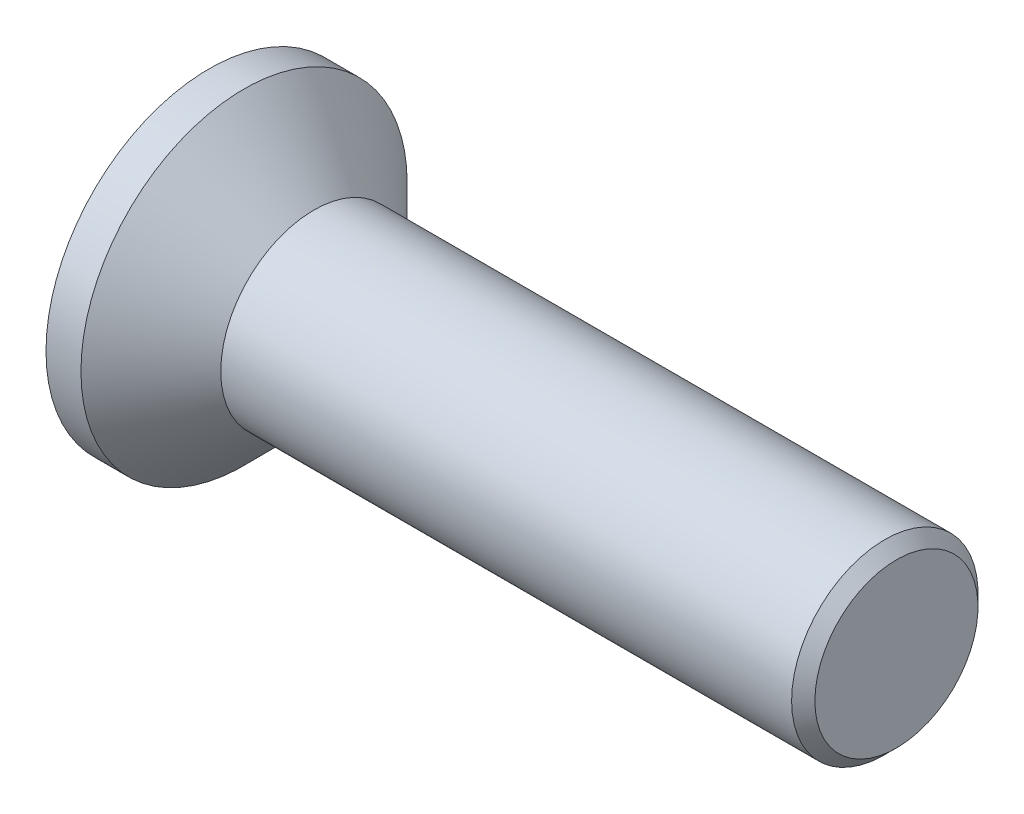
ISO-10303-21;
HEADER;
FILE_DESCRIPTION(('STEP AP214'),'2;1');
FILE_NAME('part.step','',(''),(''),'','','');
FILE_SCHEMA(('AUTOMOTIVE_DESIGN { 1 0 10303 214 1 1 1 1 }'));
ENDSEC;
DATA;
#1=APPLICATION_CONTEXT('core data for automotive mechanical design processes');
#2=APPLICATION_PROTOCOL_DEFINITION('international standard','automotive_design',2000,#1);
#3=PRODUCT_CONTEXT('',#1,'mechanical');
#4=PRODUCT('Part','Part','',(#3));
#5=PRODUCT_RELATED_PRODUCT_CATEGORY('part','',(#4));
#6=PRODUCT_DEFINITION_FORMATION('','',#4);
#7=PRODUCT_DEFINITION_CONTEXT('part definition',#1,'design');
#8=PRODUCT_DEFINITION('design','',#6,#7);
#9=PRODUCT_DEFINITION_SHAPE('','',#8);
#10=(LENGTH_UNIT() NAMED_UNIT(*) SI_UNIT(.MILLI.,.METRE.));
#11=(NAMED_UNIT(*) PLANE_ANGLE_UNIT() SI_UNIT($,.RADIAN.));
#12=(NAMED_UNIT(*) SI_UNIT($,.STERADIAN.) SOLID_ANGLE_UNIT());
#13=UNCERTAINTY_MEASURE_WITH_UNIT(LENGTH_MEASURE(1.E-05),#10,'distance_accuracy_value','');
#14=(GEOMETRIC_REPRESENTATION_CONTEXT(3) GLOBAL_UNCERTAINTY_ASSIGNED_CONTEXT((#13)) GLOBAL_UNIT_ASSIGNED_CONTEXT((#10,
#11,#12)) REPRESENTATION_CONTEXT('',''));
#15=CARTESIAN_POINT('',(0.,0.,0.));
#16=DIRECTION('',(0.,0.,1.));
#17=DIRECTION('',(1.,0.,0.));
#18=AXIS2_PLACEMENT_3D('',#15,#16,#17);
#19=CARTESIAN_POINT('',(0.,7.00000000000004,0.));
#20=DIRECTION('',(1.,0.,0.));
#21=DIRECTION('',(0.,0.,-1.00000000000001));
#22=AXIS2_PLACEMENT_3D('',#19,#20,#21);
#23=PLANE('',#22);
#24=DIRECTION('',(0.,-0.500000000000003,-0.866025403784443));
#25=VECTOR('',#24,1.);
#26=CARTESIAN_POINT('',(0.,2.88675134594817,0.));
#27=LINE('',#26,#25);
#28=CARTESIAN_POINT('',(0.,2.88675134594817,0.));
#29=VERTEX_POINT('',#28);
#30=CARTESIAN_POINT('',(0.,1.44337567297408,-2.50000000000004));
#31=VERTEX_POINT('',#30);
#32=EDGE_CURVE('E160',#29,#31,#27,.T.);
#33=ORIENTED_EDGE('',*,*,#32,.F.);
#34=DIRECTION('',(0.,0.500000000000002,-0.866025403784444));
#35=VECTOR('',#34,1.);
#36=CARTESIAN_POINT('',(0.,1.44337567297409,2.5));
#37=LINE('',#36,#35);
#38=CARTESIAN_POINT('',(0.,1.44337567297409,2.5));
#39=VERTEX_POINT('',#38);
#40=EDGE_CURVE('E79',#39,#29,#37,.T.);
#41=ORIENTED_EDGE('',*,*,#40,.F.);
#42=DIRECTION('',(0.,1.00000000000001,0.));
#43=VECTOR('',#42,1.);
#44=CARTESIAN_POINT('',(0.,-1.44337567297406,2.49999999999999));
#45=LINE('',#44,#43);
#46=CARTESIAN_POINT('',(0.,-1.44337567297406,2.49999999999999));
#47=VERTEX_POINT('',#46);
#48=EDGE_CURVE('E173',#47,#39,#45,.T.);
#49=ORIENTED_EDGE('',*,*,#48,.F.);
#50=DIRECTION('',(0.,0.500000000000003,0.866025403784443));
#51=VECTOR('',#50,1.);
#52=CARTESIAN_POINT('',(0.,-2.88675134594813,0.));
#53=LINE('',#52,#51);
#54=CARTESIAN_POINT('',(0.,-2.88675134594813,0.));
#55=VERTEX_POINT('',#54);
#56=EDGE_CURVE('E170',#55,#47,#53,.T.);
#57=ORIENTED_EDGE('',*,*,#56,.F.);
#58=DIRECTION('',(0.,-0.500000000000003,0.866025403784443));
#59=VECTOR('',#58,1.);
#60=CARTESIAN_POINT('',(0.,-1.44337567297406,-2.50000000000003));
#61=LINE('',#60,#59);
#62=CARTESIAN_POINT('',(0.,-1.44337567297406,-2.50000000000003));
#63=VERTEX_POINT('',#62);
#64=EDGE_CURVE('E127',#63,#55,#61,.T.);
#65=ORIENTED_EDGE('',*,*,#64,.F.);
#66=DIRECTION('',(0.,-1.00000000000001,0.));
#67=VECTOR('',#66,1.);
#68=CARTESIAN_POINT('',(0.,1.44337567297408,-2.50000000000004));
#69=LINE('',#68,#67);
#70=EDGE_CURVE('E164',#31,#63,#69,.T.);
#71=ORIENTED_EDGE('',*,*,#70,.F.);
#72=EDGE_LOOP('',(#33,#41,#49,#57,#65,#71));
#73=FACE_BOUND('',#72,.T.);
#74=CARTESIAN_POINT('',(0.,0.,0.));
#75=DIRECTION('',(-1.,0.,0.));
#76=DIRECTION('',(0.,0.,1.00000000000001));
#77=AXIS2_PLACEMENT_3D('',#74,#75,#76);
#78=CIRCLE('',#77,7.);
#79=CARTESIAN_POINT('',(0.,0.,7.00000000000003));
#80=VERTEX_POINT('',#79);
#81=EDGE_CURVE('E179',#80,#80,#78,.T.);
#82=ORIENTED_EDGE('',*,*,#81,.T.);
#83=EDGE_LOOP('',(#82));
#84=FACE_BOUND('',#83,.T.);
#85=ADVANCED_FACE('F62',(#73,#84),#23,.F.);
#86=CARTESIAN_POINT('',(29.5,0.,0.));
#87=DIRECTION('',(-1.,0.,0.));
#88=DIRECTION('',(0.,0.,1.00000000000001));
#89=AXIS2_PLACEMENT_3D('',#86,#87,#88);
#90=PLANE('',#89);
#91=CARTESIAN_POINT('',(29.5,0.,0.));
#92=DIRECTION('',(-1.,0.,0.));
#93=DIRECTION('',(0.,0.,1.00000000000001));
#94=AXIS2_PLACEMENT_3D('',#91,#92,#93);
#95=CIRCLE('',#94,3.49999999999999);
#96=CARTESIAN_POINT('',(29.5,0.,3.50000000000003));
#97=VERTEX_POINT('',#96);
#98=EDGE_CURVE('E13',#97,#97,#95,.F.);
#99=ORIENTED_EDGE('',*,*,#98,.T.);
#100=EDGE_LOOP('',(#99));
#101=FACE_BOUND('',#100,.T.);
#102=ADVANCED_FACE('F216',(#101),#90,.F.);
#103=CARTESIAN_POINT('',(0.,0.,0.));
#104=DIRECTION('',(-1.,0.,0.));
#105=DIRECTION('',(0.,0.,1.00000000000001));
#106=AXIS2_PLACEMENT_3D('',#103,#104,#105);
#107=CYLINDRICAL_SURFACE('',#106,4.);
#108=CARTESIAN_POINT('',(29.,0.,0.));
#109=DIRECTION('',(-1.,0.,0.));
#110=DIRECTION('',(0.,0.,1.00000000000001));
#111=AXIS2_PLACEMENT_3D('',#108,#109,#110);
#112=CIRCLE('',#111,4.);
#113=CARTESIAN_POINT('',(29.,0.,4.00000000000005));
#114=VERTEX_POINT('',#113);
#115=EDGE_CURVE('E72',#114,#114,#112,.T.);
#116=ORIENTED_EDGE('',*,*,#115,.T.);
#117=EDGE_LOOP('',(#116));
#118=FACE_BOUND('',#117,.T.);
#119=CARTESIAN_POINT('',(4.5,0.,0.));
#120=DIRECTION('',(-1.,0.,0.));
#121=DIRECTION('',(0.,0.,1.00000000000001));
#122=AXIS2_PLACEMENT_3D('',#119,#120,#121);
#123=CIRCLE('',#122,4.);
#124=CARTESIAN_POINT('',(4.5,0.,4.00000000000002));
#125=VERTEX_POINT('',#124);
#126=EDGE_CURVE('E196',#125,#125,#123,.T.);
#127=ORIENTED_EDGE('',*,*,#126,.F.);
#128=EDGE_LOOP('',(#127));
#129=FACE_BOUND('',#128,.T.);
#130=ADVANCED_FACE('F204',(#118,#129),#107,.T.);
#131=CARTESIAN_POINT('',(4.5,0.,0.));
#132=DIRECTION('',(-1.,0.,0.));
#133=DIRECTION('',(0.,0.,1.00000000000001));
#134=AXIS2_PLACEMENT_3D('',#131,#132,#133);
#135=CONICAL_SURFACE('',#134,4.,0.785398163397443);
#136=CARTESIAN_POINT('',(1.49999999999996,0.,0.));
#137=DIRECTION('',(-1.,0.,0.));
#138=DIRECTION('',(0.,0.,1.00000000000001));
#139=AXIS2_PLACEMENT_3D('',#136,#137,#138);
#140=CIRCLE('',#139,7.);
#141=CARTESIAN_POINT('',(1.49999999999996,0.,7.00000000000004));
#142=VERTEX_POINT('',#141);
#143=EDGE_CURVE('E192',#142,#142,#140,.T.);
#144=ORIENTED_EDGE('',*,*,#143,.F.);
#145=EDGE_LOOP('',(#144));
#146=FACE_BOUND('',#145,.T.);
#147=ORIENTED_EDGE('',*,*,#126,.T.);
#148=EDGE_LOOP('',(#147));
#149=FACE_BOUND('',#148,.T.);
#150=ADVANCED_FACE('F228',(#146,#149),#135,.T.);
#151=CARTESIAN_POINT('',(0.,0.,0.));
#152=DIRECTION('',(-1.,0.,0.));
#153=DIRECTION('',(0.,0.,1.00000000000001));
#154=AXIS2_PLACEMENT_3D('',#151,#152,#153);
#155=CYLINDRICAL_SURFACE('',#154,7.);
#156=ORIENTED_EDGE('',*,*,#81,.F.);
#157=EDGE_LOOP('',(#156));
#158=FACE_BOUND('',#157,.T.);
#159=ORIENTED_EDGE('',*,*,#143,.T.);
#160=EDGE_LOOP('',(#159));
#161=FACE_BOUND('',#160,.T.);
#162=ADVANCED_FACE('F231',(#158,#161),#155,.T.);
#163=CARTESIAN_POINT('',(3.5,1.4433756729741,2.50000000000001));
#164=DIRECTION('',(0.,0.866025403784443,0.500000000000002));
#165=DIRECTION('',(0.,-0.500000000000002,0.866025403784443));
#166=AXIS2_PLACEMENT_3D('',#163,#164,#165);
#167=PLANE('',#166);
#168=ORIENTED_EDGE('',*,*,#40,.T.);
#169=DIRECTION('',(-1.,0.,0.));
#170=VECTOR('',#169,1.);
#171=CARTESIAN_POINT('',(3.5,2.88675134594817,0.));
#172=LINE('',#171,#170);
#173=CARTESIAN_POINT('',(3.5,2.88675134594817,0.));
#174=VERTEX_POINT('',#173);
#175=EDGE_CURVE('E109',#174,#29,#172,.T.);
#176=ORIENTED_EDGE('',*,*,#175,.F.);
#177=DIRECTION('',(0.,0.500000000000002,-0.866025403784444));
#178=VECTOR('',#177,1.);
#179=CARTESIAN_POINT('',(3.5,1.4433756729741,2.50000000000001));
#180=LINE('',#179,#178);
#181=CARTESIAN_POINT('',(3.5,1.4433756729741,2.50000000000001));
#182=VERTEX_POINT('',#181);
#183=EDGE_CURVE('E176',#182,#174,#180,.T.);
#184=ORIENTED_EDGE('',*,*,#183,.F.);
#185=DIRECTION('',(-1.,0.,0.));
#186=VECTOR('',#185,1.);
#187=CARTESIAN_POINT('',(3.5,1.4433756729741,2.50000000000001));
#188=LINE('',#187,#186);
#189=EDGE_CURVE('E87',#182,#39,#188,.T.);
#190=ORIENTED_EDGE('',*,*,#189,.T.);
#191=EDGE_LOOP('',(#168,#176,#184,#190));
#192=FACE_BOUND('',#191,.T.);
#193=ADVANCED_FACE('F235',(#192),#167,.F.);
#194=CARTESIAN_POINT('',(3.5,-1.44337567297403,2.50000000000001));
#195=DIRECTION('',(0.,0.,1.00000000000001));
#196=DIRECTION('',(0.,-1.00000000000001,0.));
#197=AXIS2_PLACEMENT_3D('',#194,#195,#196);
#198=PLANE('',#197);
#199=ORIENTED_EDGE('',*,*,#48,.T.);
#200=ORIENTED_EDGE('',*,*,#189,.F.);
#201=DIRECTION('',(0.,1.00000000000001,0.));
#202=VECTOR('',#201,1.);
#203=CARTESIAN_POINT('',(3.5,-1.44337567297403,2.50000000000001));
#204=LINE('',#203,#202);
#205=CARTESIAN_POINT('',(3.5,-1.44337567297403,2.50000000000001));
#206=VERTEX_POINT('',#205);
#207=EDGE_CURVE('E141',#206,#182,#204,.T.);
#208=ORIENTED_EDGE('',*,*,#207,.F.);
#209=DIRECTION('',(-1.,0.,0.));
#210=VECTOR('',#209,1.);
#211=CARTESIAN_POINT('',(3.5,-1.44337567297403,2.50000000000001));
#212=LINE('',#211,#210);
#213=EDGE_CURVE('E132',#206,#47,#212,.T.);
#214=ORIENTED_EDGE('',*,*,#213,.T.);
#215=EDGE_LOOP('',(#199,#200,#208,#214));
#216=FACE_BOUND('',#215,.T.);
#217=ADVANCED_FACE('F239',(#216),#198,.F.);
#218=CARTESIAN_POINT('',(3.5,-2.88675134594813,0.));
#219=DIRECTION('',(0.,-0.866025403784443,0.500000000000003));
#220=DIRECTION('',(0.,-0.500000000000003,-0.866025403784443));
#221=AXIS2_PLACEMENT_3D('',#218,#219,#220);
#222=PLANE('',#221);
#223=ORIENTED_EDGE('',*,*,#56,.T.);
#224=ORIENTED_EDGE('',*,*,#213,.F.);
#225=DIRECTION('',(0.,0.500000000000003,0.866025403784443));
#226=VECTOR('',#225,1.);
#227=CARTESIAN_POINT('',(3.5,-2.88675134594813,0.));
#228=LINE('',#227,#226);
#229=CARTESIAN_POINT('',(3.5,-2.88675134594813,0.));
#230=VERTEX_POINT('',#229);
#231=EDGE_CURVE('E136',#230,#206,#228,.T.);
#232=ORIENTED_EDGE('',*,*,#231,.F.);
#233=DIRECTION('',(-1.,0.,0.));
#234=VECTOR('',#233,1.);
#235=CARTESIAN_POINT('',(3.5,-2.88675134594813,0.));
#236=LINE('',#235,#234);
#237=EDGE_CURVE('E120',#230,#55,#236,.T.);
#238=ORIENTED_EDGE('',*,*,#237,.T.);
#239=EDGE_LOOP('',(#223,#224,#232,#238));
#240=FACE_BOUND('',#239,.T.);
#241=ADVANCED_FACE('F137',(#240),#222,.F.);
#242=CARTESIAN_POINT('',(3.5,-1.44337567297406,-2.50000000000003));
#243=DIRECTION('',(0.,-0.866025403784443,-0.500000000000003));
#244=DIRECTION('',(0.,0.500000000000003,-0.866025403784443));
#245=AXIS2_PLACEMENT_3D('',#242,#243,#244);
#246=PLANE('',#245);
#247=ORIENTED_EDGE('',*,*,#64,.T.);
#248=ORIENTED_EDGE('',*,*,#237,.F.);
#249=DIRECTION('',(0.,-0.500000000000003,0.866025403784443));
#250=VECTOR('',#249,1.);
#251=CARTESIAN_POINT('',(3.5,-1.44337567297406,-2.50000000000003));
#252=LINE('',#251,#250);
#253=CARTESIAN_POINT('',(3.5,-1.44337567297406,-2.50000000000003));
#254=VERTEX_POINT('',#253);
#255=EDGE_CURVE('E124',#254,#230,#252,.T.);
#256=ORIENTED_EDGE('',*,*,#255,.F.);
#257=DIRECTION('',(-1.,0.,0.));
#258=VECTOR('',#257,1.);
#259=CARTESIAN_POINT('',(3.5,-1.44337567297406,-2.50000000000003));
#260=LINE('',#259,#258);
#261=EDGE_CURVE('E133',#254,#63,#260,.T.);
#262=ORIENTED_EDGE('',*,*,#261,.T.);
#263=EDGE_LOOP('',(#247,#248,#256,#262));
#264=FACE_BOUND('',#263,.T.);
#265=ADVANCED_FACE('F122',(#264),#246,.F.);
#266=CARTESIAN_POINT('',(3.5,1.4433756729741,-2.50000000000001));
#267=DIRECTION('',(0.,0.,-1.00000000000001));
#268=DIRECTION('',(0.,1.00000000000001,0.));
#269=AXIS2_PLACEMENT_3D('',#266,#267,#268);
#270=PLANE('',#269);
#271=ORIENTED_EDGE('',*,*,#70,.T.);
#272=ORIENTED_EDGE('',*,*,#261,.F.);
#273=DIRECTION('',(0.,-1.00000000000001,0.));
#274=VECTOR('',#273,1.);
#275=CARTESIAN_POINT('',(3.5,1.4433756729741,-2.50000000000001));
#276=LINE('',#275,#274);
#277=CARTESIAN_POINT('',(3.5,1.4433756729741,-2.50000000000001));
#278=VERTEX_POINT('',#277);
#279=EDGE_CURVE('E147',#278,#254,#276,.T.);
#280=ORIENTED_EDGE('',*,*,#279,.F.);
#281=DIRECTION('',(-1.,0.,0.));
#282=VECTOR('',#281,1.);
#283=CARTESIAN_POINT('',(3.5,1.4433756729741,-2.50000000000001));
#284=LINE('',#283,#282);
#285=EDGE_CURVE('E184',#278,#31,#284,.T.);
#286=ORIENTED_EDGE('',*,*,#285,.T.);
#287=EDGE_LOOP('',(#271,#272,#280,#286));
#288=FACE_BOUND('',#287,.T.);
#289=ADVANCED_FACE('F242',(#288),#270,.F.);
#290=CARTESIAN_POINT('',(3.5,2.88675134594817,0.));
#291=DIRECTION('',(0.,0.866025403784443,-0.500000000000003));
#292=DIRECTION('',(0.,0.500000000000003,0.866025403784443));
#293=AXIS2_PLACEMENT_3D('',#290,#291,#292);
#294=PLANE('',#293);
#295=ORIENTED_EDGE('',*,*,#32,.T.);
#296=ORIENTED_EDGE('',*,*,#285,.F.);
#297=DIRECTION('',(0.,-0.500000000000003,-0.866025403784443));
#298=VECTOR('',#297,1.);
#299=CARTESIAN_POINT('',(3.5,2.88675134594817,0.));
#300=LINE('',#299,#298);
#301=EDGE_CURVE('E152',#174,#278,#300,.T.);
#302=ORIENTED_EDGE('',*,*,#301,.F.);
#303=ORIENTED_EDGE('',*,*,#175,.T.);
#304=EDGE_LOOP('',(#295,#296,#302,#303));
#305=FACE_BOUND('',#304,.T.);
#306=ADVANCED_FACE('F212',(#305),#294,.F.);
#307=CARTESIAN_POINT('',(3.5,0.,0.));
#308=DIRECTION('',(-1.,0.,0.));
#309=DIRECTION('',(0.,0.,1.00000000000001));
#310=AXIS2_PLACEMENT_3D('',#307,#308,#309);
#311=PLANE('',#310);
#312=ORIENTED_EDGE('',*,*,#183,.T.);
#313=ORIENTED_EDGE('',*,*,#301,.T.);
#314=ORIENTED_EDGE('',*,*,#279,.T.);
#315=ORIENTED_EDGE('',*,*,#255,.T.);
#316=ORIENTED_EDGE('',*,*,#231,.T.);
#317=ORIENTED_EDGE('',*,*,#207,.T.);
#318=EDGE_LOOP('',(#312,#313,#314,#315,#316,#317));
#319=FACE_BOUND('',#318,.T.);
#320=ADVANCED_FACE('F144',(#319),#311,.T.);
#321=CARTESIAN_POINT('',(29.,0.,0.));
#322=DIRECTION('',(-1.,0.,0.));
#323=DIRECTION('',(0.,0.,1.00000000000001));
#324=AXIS2_PLACEMENT_3D('',#321,#322,#323);
#325=CONICAL_SURFACE('',#324,4.,0.785398163397456);
#326=ORIENTED_EDGE('',*,*,#98,.F.);
#327=EDGE_LOOP('',(#326));
#328=FACE_BOUND('',#327,.T.);
#329=ORIENTED_EDGE('',*,*,#115,.F.);
#330=EDGE_LOOP('',(#329));
#331=FACE_BOUND('',#330,.T.);
#332=ADVANCED_FACE('F65',(#328,#331),#325,.T.);
#333=CLOSED_SHELL('',(#85,#102,#130,#150,#162,#193,#217,#241,#265,#289,#306,#320,#332));
#334=MANIFOLD_SOLID_BREP('B2',#333);
#335=ADVANCED_BREP_SHAPE_REPRESENTATION('',(#18,#334),#14);
#336=SHAPE_DEFINITION_REPRESENTATION(#9,#335);
ENDSEC;
END-ISO-10303-21;
